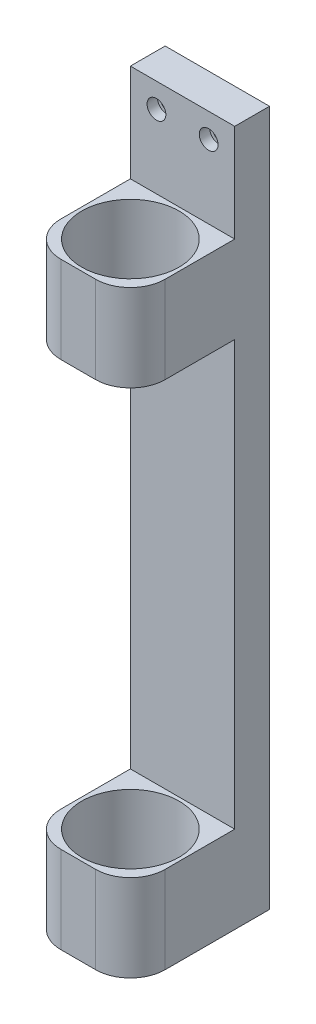
ISO-10303-21;
HEADER;
FILE_DESCRIPTION(('STEP AP214'),'2;1');
FILE_NAME('part.step','',(''),(''),'','','');
FILE_SCHEMA(('AUTOMOTIVE_DESIGN { 1 0 10303 214 1 1 1 1 }'));
ENDSEC;
DATA;
#1=APPLICATION_CONTEXT('core data for automotive mechanical design processes');
#2=APPLICATION_PROTOCOL_DEFINITION('international standard','automotive_design',2000,#1);
#3=PRODUCT_CONTEXT('',#1,'mechanical');
#4=PRODUCT('Part','Part','',(#3));
#5=PRODUCT_RELATED_PRODUCT_CATEGORY('part','',(#4));
#6=PRODUCT_DEFINITION_FORMATION('','',#4);
#7=PRODUCT_DEFINITION_CONTEXT('part definition',#1,'design');
#8=PRODUCT_DEFINITION('design','',#6,#7);
#9=PRODUCT_DEFINITION_SHAPE('','',#8);
#10=(LENGTH_UNIT() NAMED_UNIT(*) SI_UNIT(.MILLI.,.METRE.));
#11=(NAMED_UNIT(*) PLANE_ANGLE_UNIT() SI_UNIT($,.RADIAN.));
#12=(NAMED_UNIT(*) SI_UNIT($,.STERADIAN.) SOLID_ANGLE_UNIT());
#13=UNCERTAINTY_MEASURE_WITH_UNIT(LENGTH_MEASURE(1.E-05),#10,'distance_accuracy_value','');
#14=(GEOMETRIC_REPRESENTATION_CONTEXT(3) GLOBAL_UNCERTAINTY_ASSIGNED_CONTEXT((#13)) GLOBAL_UNIT_ASSIGNED_CONTEXT((#10,
#11,#12)) REPRESENTATION_CONTEXT('',''));
#15=CARTESIAN_POINT('',(0.,0.,0.));
#16=DIRECTION('',(0.,0.,1.));
#17=DIRECTION('',(1.,0.,0.));
#18=AXIS2_PLACEMENT_3D('',#15,#16,#17);
#19=CARTESIAN_POINT('',(5.,200.,25.));
#20=DIRECTION('',(0.,1.,0.));
#21=DIRECTION('',(0.,0.,1.));
#22=AXIS2_PLACEMENT_3D('',#19,#20,#21);
#23=CYLINDRICAL_SURFACE('',#22,10.);
#24=DIRECTION('',(0.,-1.,0.));
#25=VECTOR('',#24,1.);
#26=CARTESIAN_POINT('',(15.,200.,25.));
#27=LINE('',#26,#25);
#28=CARTESIAN_POINT('',(15.,171.928426997617,25.));
#29=VERTEX_POINT('',#28);
#30=CARTESIAN_POINT('',(15.,146.928426997617,25.));
#31=VERTEX_POINT('',#30);
#32=EDGE_CURVE('E143',#29,#31,#27,.T.);
#33=ORIENTED_EDGE('',*,*,#32,.F.);
#34=CARTESIAN_POINT('',(5.,171.928426997617,25.));
#35=DIRECTION('',(0.,-1.,0.));
#36=DIRECTION('',(0.,0.,-1.));
#37=AXIS2_PLACEMENT_3D('',#34,#35,#36);
#38=CIRCLE('',#37,10.);
#39=CARTESIAN_POINT('',(5.,171.928426997617,35.));
#40=VERTEX_POINT('',#39);
#41=EDGE_CURVE('E48',#40,#29,#38,.F.);
#42=ORIENTED_EDGE('',*,*,#41,.F.);
#43=DIRECTION('',(0.,-1.,0.));
#44=VECTOR('',#43,1.);
#45=CARTESIAN_POINT('',(5.,200.,35.));
#46=LINE('',#45,#44);
#47=CARTESIAN_POINT('',(5.,146.928426997617,35.));
#48=VERTEX_POINT('',#47);
#49=EDGE_CURVE('E257',#48,#40,#46,.F.);
#50=ORIENTED_EDGE('',*,*,#49,.F.);
#51=CARTESIAN_POINT('',(5.,146.928426997617,25.));
#52=DIRECTION('',(0.,1.,0.));
#53=DIRECTION('',(0.,0.,1.));
#54=AXIS2_PLACEMENT_3D('',#51,#52,#53);
#55=CIRCLE('',#54,10.);
#56=EDGE_CURVE('E11',#31,#48,#55,.F.);
#57=ORIENTED_EDGE('',*,*,#56,.F.);
#58=EDGE_LOOP('',(#33,#42,#50,#57));
#59=FACE_BOUND('',#58,.T.);
#60=ADVANCED_FACE('F37',(#59),#23,.T.);
#61=CARTESIAN_POINT('',(-5.,200.,25.));
#62=DIRECTION('',(0.,-1.,0.));
#63=DIRECTION('',(0.,0.,-1.));
#64=AXIS2_PLACEMENT_3D('',#61,#62,#63);
#65=CYLINDRICAL_SURFACE('',#64,10.);
#66=DIRECTION('',(0.,1.,0.));
#67=VECTOR('',#66,1.);
#68=CARTESIAN_POINT('',(-15.,200.,25.));
#69=LINE('',#68,#67);
#70=CARTESIAN_POINT('',(-15.,146.928426997617,25.));
#71=VERTEX_POINT('',#70);
#72=CARTESIAN_POINT('',(-15.,171.928426997617,25.));
#73=VERTEX_POINT('',#72);
#74=EDGE_CURVE('E242',#71,#73,#69,.T.);
#75=ORIENTED_EDGE('',*,*,#74,.F.);
#76=CARTESIAN_POINT('',(-5.,146.928426997617,25.));
#77=DIRECTION('',(0.,1.,0.));
#78=DIRECTION('',(0.,0.,1.));
#79=AXIS2_PLACEMENT_3D('',#76,#77,#78);
#80=CIRCLE('',#79,10.);
#81=CARTESIAN_POINT('',(-5.,146.928426997617,35.));
#82=VERTEX_POINT('',#81);
#83=EDGE_CURVE('E249',#82,#71,#80,.F.);
#84=ORIENTED_EDGE('',*,*,#83,.F.);
#85=DIRECTION('',(0.,1.,0.));
#86=VECTOR('',#85,1.);
#87=CARTESIAN_POINT('',(-5.,200.,35.));
#88=LINE('',#87,#86);
#89=CARTESIAN_POINT('',(-5.,171.928426997617,35.));
#90=VERTEX_POINT('',#89);
#91=EDGE_CURVE('E250',#90,#82,#88,.F.);
#92=ORIENTED_EDGE('',*,*,#91,.F.);
#93=CARTESIAN_POINT('',(-5.,171.928426997617,25.));
#94=DIRECTION('',(0.,-1.,0.));
#95=DIRECTION('',(0.,0.,-1.));
#96=AXIS2_PLACEMENT_3D('',#93,#94,#95);
#97=CIRCLE('',#96,10.);
#98=EDGE_CURVE('E255',#73,#90,#97,.F.);
#99=ORIENTED_EDGE('',*,*,#98,.F.);
#100=EDGE_LOOP('',(#75,#84,#92,#99));
#101=FACE_BOUND('',#100,.T.);
#102=ADVANCED_FACE('F277',(#101),#65,.T.);
#103=CARTESIAN_POINT('',(-15.,200.,5.));
#104=DIRECTION('',(0.,0.,-1.));
#105=DIRECTION('',(-1.,0.,0.));
#106=AXIS2_PLACEMENT_3D('',#103,#104,#105);
#107=PLANE('',#106);
#108=CARTESIAN_POINT('',(7.5,192.982106749404,5.));
#109=DIRECTION('',(0.,0.,1.));
#110=DIRECTION('',(1.,0.,0.));
#111=AXIS2_PLACEMENT_3D('',#108,#109,#110);
#112=CIRCLE('',#111,2.7);
#113=CARTESIAN_POINT('',(10.2,192.982106749404,5.));
#114=VERTEX_POINT('',#113);
#115=EDGE_CURVE('E302',#114,#114,#112,.T.);
#116=ORIENTED_EDGE('',*,*,#115,.F.);
#117=EDGE_LOOP('',(#116));
#118=FACE_BOUND('',#117,.T.);
#119=CARTESIAN_POINT('',(-7.5,192.982106749404,5.));
#120=DIRECTION('',(0.,0.,1.));
#121=DIRECTION('',(1.,0.,0.));
#122=AXIS2_PLACEMENT_3D('',#119,#120,#121);
#123=CIRCLE('',#122,2.7);
#124=CARTESIAN_POINT('',(-4.8,192.982106749404,5.));
#125=VERTEX_POINT('',#124);
#126=EDGE_CURVE('E292',#125,#125,#123,.T.);
#127=ORIENTED_EDGE('',*,*,#126,.F.);
#128=EDGE_LOOP('',(#127));
#129=FACE_BOUND('',#128,.T.);
#130=DIRECTION('',(-1.,0.,0.));
#131=VECTOR('',#130,1.);
#132=CARTESIAN_POINT('',(-15.,171.928426997617,5.));
#133=LINE('',#132,#131);
#134=CARTESIAN_POINT('',(15.,171.928426997617,5.));
#135=VERTEX_POINT('',#134);
#136=CARTESIAN_POINT('',(-15.,171.928426997617,5.));
#137=VERTEX_POINT('',#136);
#138=EDGE_CURVE('E161',#135,#137,#133,.T.);
#139=ORIENTED_EDGE('',*,*,#138,.F.);
#140=DIRECTION('',(0.,-1.,0.));
#141=VECTOR('',#140,1.);
#142=CARTESIAN_POINT('',(15.,200.,5.));
#143=LINE('',#142,#141);
#144=CARTESIAN_POINT('',(15.,200.,5.));
#145=VERTEX_POINT('',#144);
#146=EDGE_CURVE('E159',#145,#135,#143,.T.);
#147=ORIENTED_EDGE('',*,*,#146,.F.);
#148=DIRECTION('',(1.,0.,0.));
#149=VECTOR('',#148,1.);
#150=CARTESIAN_POINT('',(-15.,200.,5.));
#151=LINE('',#150,#149);
#152=CARTESIAN_POINT('',(-15.,200.,5.));
#153=VERTEX_POINT('',#152);
#154=EDGE_CURVE('E158',#153,#145,#151,.T.);
#155=ORIENTED_EDGE('',*,*,#154,.F.);
#156=DIRECTION('',(0.,-1.,0.));
#157=VECTOR('',#156,1.);
#158=CARTESIAN_POINT('',(-15.,200.,5.));
#159=LINE('',#158,#157);
#160=EDGE_CURVE('E211',#153,#137,#159,.T.);
#161=ORIENTED_EDGE('',*,*,#160,.T.);
#162=EDGE_LOOP('',(#139,#147,#155,#161));
#163=FACE_BOUND('',#162,.T.);
#164=ADVANCED_FACE('F267',(#118,#129,#163),#107,.F.);
#165=DIRECTION('',(1.,0.,0.));
#166=VECTOR('',#165,1.);
#167=CARTESIAN_POINT('',(-15.,146.928426997617,5.));
#168=LINE('',#167,#166);
#169=CARTESIAN_POINT('',(-15.,146.928426997617,5.));
#170=VERTEX_POINT('',#169);
#171=CARTESIAN_POINT('',(15.,146.928426997617,5.));
#172=VERTEX_POINT('',#171);
#173=EDGE_CURVE('E152',#170,#172,#168,.T.);
#174=ORIENTED_EDGE('',*,*,#173,.F.);
#175=CARTESIAN_POINT('',(-15.,25.,5.));
#176=VERTEX_POINT('',#175);
#177=EDGE_CURVE('E214',#170,#176,#159,.T.);
#178=ORIENTED_EDGE('',*,*,#177,.T.);
#179=DIRECTION('',(-1.,0.,0.));
#180=VECTOR('',#179,1.);
#181=CARTESIAN_POINT('',(-15.,25.,5.));
#182=LINE('',#181,#180);
#183=CARTESIAN_POINT('',(15.,25.,5.));
#184=VERTEX_POINT('',#183);
#185=EDGE_CURVE('E157',#184,#176,#182,.T.);
#186=ORIENTED_EDGE('',*,*,#185,.F.);
#187=EDGE_CURVE('E141',#172,#184,#143,.T.);
#188=ORIENTED_EDGE('',*,*,#187,.F.);
#189=EDGE_LOOP('',(#174,#178,#186,#188));
#190=FACE_BOUND('',#189,.T.);
#191=ADVANCED_FACE('F153',(#190),#107,.F.);
#192=CARTESIAN_POINT('',(-5.,0.,25.));
#193=DIRECTION('',(0.,-1.,0.));
#194=DIRECTION('',(0.,0.,-1.));
#195=AXIS2_PLACEMENT_3D('',#192,#193,#194);
#196=CYLINDRICAL_SURFACE('',#195,10.);
#197=DIRECTION('',(0.,-1.,0.));
#198=VECTOR('',#197,1.);
#199=CARTESIAN_POINT('',(-5.,0.,35.));
#200=LINE('',#199,#198);
#201=CARTESIAN_POINT('',(-5.,25.,35.));
#202=VERTEX_POINT('',#201);
#203=CARTESIAN_POINT('',(-5.,0.,35.));
#204=VERTEX_POINT('',#203);
#205=EDGE_CURVE('E234',#202,#204,#200,.T.);
#206=ORIENTED_EDGE('',*,*,#205,.F.);
#207=CARTESIAN_POINT('',(-5.,25.,25.));
#208=DIRECTION('',(0.,-1.,0.));
#209=DIRECTION('',(0.,0.,-1.));
#210=AXIS2_PLACEMENT_3D('',#207,#208,#209);
#211=CIRCLE('',#210,10.);
#212=CARTESIAN_POINT('',(-15.,25.,25.));
#213=VERTEX_POINT('',#212);
#214=EDGE_CURVE('E239',#213,#202,#211,.F.);
#215=ORIENTED_EDGE('',*,*,#214,.F.);
#216=DIRECTION('',(0.,-1.,0.));
#217=VECTOR('',#216,1.);
#218=CARTESIAN_POINT('',(-15.,200.,25.));
#219=LINE('',#218,#217);
#220=CARTESIAN_POINT('',(-15.,0.,25.));
#221=VERTEX_POINT('',#220);
#222=EDGE_CURVE('E240',#221,#213,#219,.F.);
#223=ORIENTED_EDGE('',*,*,#222,.F.);
#224=CARTESIAN_POINT('',(-5.,0.,25.));
#225=DIRECTION('',(0.,-1.,0.));
#226=DIRECTION('',(0.,0.,-1.));
#227=AXIS2_PLACEMENT_3D('',#224,#225,#226);
#228=CIRCLE('',#227,10.);
#229=EDGE_CURVE('E245',#204,#221,#228,.T.);
#230=ORIENTED_EDGE('',*,*,#229,.F.);
#231=EDGE_LOOP('',(#206,#215,#223,#230));
#232=FACE_BOUND('',#231,.T.);
#233=ADVANCED_FACE('F332',(#232),#196,.T.);
#234=CARTESIAN_POINT('',(5.,200.,25.));
#235=DIRECTION('',(0.,-1.,0.));
#236=DIRECTION('',(0.,0.,-1.));
#237=AXIS2_PLACEMENT_3D('',#234,#235,#236);
#238=CYLINDRICAL_SURFACE('',#237,10.);
#239=DIRECTION('',(0.,-1.,0.));
#240=VECTOR('',#239,1.);
#241=CARTESIAN_POINT('',(15.,200.,25.));
#242=LINE('',#241,#240);
#243=CARTESIAN_POINT('',(15.,25.,25.));
#244=VERTEX_POINT('',#243);
#245=CARTESIAN_POINT('',(15.,0.,25.));
#246=VERTEX_POINT('',#245);
#247=EDGE_CURVE('E224',#244,#246,#242,.T.);
#248=ORIENTED_EDGE('',*,*,#247,.F.);
#249=CARTESIAN_POINT('',(5.,25.,25.));
#250=DIRECTION('',(0.,-1.,0.));
#251=DIRECTION('',(0.,0.,-1.));
#252=AXIS2_PLACEMENT_3D('',#249,#250,#251);
#253=CIRCLE('',#252,10.);
#254=CARTESIAN_POINT('',(5.,25.,35.));
#255=VERTEX_POINT('',#254);
#256=EDGE_CURVE('E230',#255,#244,#253,.F.);
#257=ORIENTED_EDGE('',*,*,#256,.F.);
#258=DIRECTION('',(0.,-1.,0.));
#259=VECTOR('',#258,1.);
#260=CARTESIAN_POINT('',(5.,0.,35.));
#261=LINE('',#260,#259);
#262=CARTESIAN_POINT('',(5.,0.,35.));
#263=VERTEX_POINT('',#262);
#264=EDGE_CURVE('E228',#263,#255,#261,.F.);
#265=ORIENTED_EDGE('',*,*,#264,.F.);
#266=CARTESIAN_POINT('',(5.,0.,25.));
#267=DIRECTION('',(0.,-1.,0.));
#268=DIRECTION('',(0.,0.,-1.));
#269=AXIS2_PLACEMENT_3D('',#266,#267,#268);
#270=CIRCLE('',#269,10.);
#271=EDGE_CURVE('E233',#246,#263,#270,.T.);
#272=ORIENTED_EDGE('',*,*,#271,.F.);
#273=EDGE_LOOP('',(#248,#257,#265,#272));
#274=FACE_BOUND('',#273,.T.);
#275=ADVANCED_FACE('F338',(#274),#238,.T.);
#276=CARTESIAN_POINT('',(15.,200.,5.));
#277=DIRECTION('',(-1.,0.,0.));
#278=DIRECTION('',(0.,0.,1.));
#279=AXIS2_PLACEMENT_3D('',#276,#277,#278);
#280=PLANE('',#279);
#281=DIRECTION('',(0.,0.,-1.));
#282=VECTOR('',#281,1.);
#283=CARTESIAN_POINT('',(15.,171.928426997617,35.));
#284=LINE('',#283,#282);
#285=EDGE_CURVE('E149',#29,#135,#284,.T.);
#286=ORIENTED_EDGE('',*,*,#285,.F.);
#287=ORIENTED_EDGE('',*,*,#32,.T.);
#288=DIRECTION('',(0.,0.,-1.));
#289=VECTOR('',#288,1.);
#290=CARTESIAN_POINT('',(15.,146.928426997617,35.));
#291=LINE('',#290,#289);
#292=EDGE_CURVE('E139',#31,#172,#291,.T.);
#293=ORIENTED_EDGE('',*,*,#292,.T.);
#294=ORIENTED_EDGE('',*,*,#187,.T.);
#295=DIRECTION('',(0.,0.,-1.));
#296=VECTOR('',#295,1.);
#297=CARTESIAN_POINT('',(15.,25.,35.));
#298=LINE('',#297,#296);
#299=EDGE_CURVE('E193',#244,#184,#298,.T.);
#300=ORIENTED_EDGE('',*,*,#299,.F.);
#301=ORIENTED_EDGE('',*,*,#247,.T.);
#302=DIRECTION('',(0.,0.,-1.));
#303=VECTOR('',#302,1.);
#304=CARTESIAN_POINT('',(15.,0.,5.));
#305=LINE('',#304,#303);
#306=CARTESIAN_POINT('',(15.,0.,-5.));
#307=VERTEX_POINT('',#306);
#308=EDGE_CURVE('E200',#246,#307,#305,.T.);
#309=ORIENTED_EDGE('',*,*,#308,.T.);
#310=DIRECTION('',(0.,-1.,0.));
#311=VECTOR('',#310,1.);
#312=CARTESIAN_POINT('',(15.,200.,-5.));
#313=LINE('',#312,#311);
#314=CARTESIAN_POINT('',(15.,200.,-5.));
#315=VERTEX_POINT('',#314);
#316=EDGE_CURVE('E219',#315,#307,#313,.T.);
#317=ORIENTED_EDGE('',*,*,#316,.F.);
#318=DIRECTION('',(0.,0.,-1.));
#319=VECTOR('',#318,1.);
#320=CARTESIAN_POINT('',(15.,200.,5.));
#321=LINE('',#320,#319);
#322=EDGE_CURVE('E198',#145,#315,#321,.T.);
#323=ORIENTED_EDGE('',*,*,#322,.F.);
#324=ORIENTED_EDGE('',*,*,#146,.T.);
#325=EDGE_LOOP('',(#286,#287,#293,#294,#300,#301,#309,#317,#323,#324));
#326=FACE_BOUND('',#325,.T.);
#327=ADVANCED_FACE('F142',(#326),#280,.F.);
#328=CARTESIAN_POINT('',(-15.,200.,-5.));
#329=DIRECTION('',(0.,0.,1.));
#330=DIRECTION('',(1.,0.,0.));
#331=AXIS2_PLACEMENT_3D('',#328,#329,#330);
#332=PLANE('',#331);
#333=CARTESIAN_POINT('',(7.5,192.982106749404,-5.));
#334=DIRECTION('',(0.,0.,1.));
#335=DIRECTION('',(1.,0.,0.));
#336=AXIS2_PLACEMENT_3D('',#333,#334,#335);
#337=CIRCLE('',#336,1.7);
#338=CARTESIAN_POINT('',(9.2,192.982106749404,-5.));
#339=VERTEX_POINT('',#338);
#340=EDGE_CURVE('E294',#339,#339,#337,.T.);
#341=ORIENTED_EDGE('',*,*,#340,.T.);
#342=EDGE_LOOP('',(#341));
#343=FACE_BOUND('',#342,.T.);
#344=CARTESIAN_POINT('',(-7.5,192.982106749404,-5.));
#345=DIRECTION('',(0.,0.,1.));
#346=DIRECTION('',(1.,0.,0.));
#347=AXIS2_PLACEMENT_3D('',#344,#345,#346);
#348=CIRCLE('',#347,1.7);
#349=CARTESIAN_POINT('',(-5.8,192.982106749404,-5.));
#350=VERTEX_POINT('',#349);
#351=EDGE_CURVE('E283',#350,#350,#348,.T.);
#352=ORIENTED_EDGE('',*,*,#351,.T.);
#353=EDGE_LOOP('',(#352));
#354=FACE_BOUND('',#353,.T.);
#355=DIRECTION('',(-1.,0.,0.));
#356=VECTOR('',#355,1.);
#357=CARTESIAN_POINT('',(-15.,0.,-5.));
#358=LINE('',#357,#356);
#359=CARTESIAN_POINT('',(-15.,0.,-5.));
#360=VERTEX_POINT('',#359);
#361=EDGE_CURVE('E206',#307,#360,#358,.T.);
#362=ORIENTED_EDGE('',*,*,#361,.T.);
#363=DIRECTION('',(0.,-1.,0.));
#364=VECTOR('',#363,1.);
#365=CARTESIAN_POINT('',(-15.,200.,-5.));
#366=LINE('',#365,#364);
#367=CARTESIAN_POINT('',(-15.,200.,-5.));
#368=VERTEX_POINT('',#367);
#369=EDGE_CURVE('E220',#368,#360,#366,.T.);
#370=ORIENTED_EDGE('',*,*,#369,.F.);
#371=DIRECTION('',(-1.,0.,0.));
#372=VECTOR('',#371,1.);
#373=CARTESIAN_POINT('',(-15.,200.,-5.));
#374=LINE('',#373,#372);
#375=EDGE_CURVE('E201',#315,#368,#374,.T.);
#376=ORIENTED_EDGE('',*,*,#375,.F.);
#377=ORIENTED_EDGE('',*,*,#316,.T.);
#378=EDGE_LOOP('',(#362,#370,#376,#377));
#379=FACE_BOUND('',#378,.T.);
#380=ADVANCED_FACE('F340',(#343,#354,#379),#332,.F.);
#381=CARTESIAN_POINT('',(-15.,200.,5.));
#382=DIRECTION('',(1.,0.,0.));
#383=DIRECTION('',(0.,0.,-1.));
#384=AXIS2_PLACEMENT_3D('',#381,#382,#383);
#385=PLANE('',#384);
#386=DIRECTION('',(0.,0.,-1.));
#387=VECTOR('',#386,1.);
#388=CARTESIAN_POINT('',(-15.,146.928426997617,35.));
#389=LINE('',#388,#387);
#390=EDGE_CURVE('E150',#71,#170,#389,.T.);
#391=ORIENTED_EDGE('',*,*,#390,.F.);
#392=ORIENTED_EDGE('',*,*,#74,.T.);
#393=DIRECTION('',(0.,0.,-1.));
#394=VECTOR('',#393,1.);
#395=CARTESIAN_POINT('',(-15.,171.928426997617,35.));
#396=LINE('',#395,#394);
#397=EDGE_CURVE('E176',#73,#137,#396,.T.);
#398=ORIENTED_EDGE('',*,*,#397,.T.);
#399=ORIENTED_EDGE('',*,*,#160,.F.);
#400=DIRECTION('',(0.,0.,1.));
#401=VECTOR('',#400,1.);
#402=CARTESIAN_POINT('',(-15.,200.,5.));
#403=LINE('',#402,#401);
#404=EDGE_CURVE('E203',#368,#153,#403,.T.);
#405=ORIENTED_EDGE('',*,*,#404,.F.);
#406=ORIENTED_EDGE('',*,*,#369,.T.);
#407=DIRECTION('',(0.,0.,1.));
#408=VECTOR('',#407,1.);
#409=CARTESIAN_POINT('',(-15.,0.,5.));
#410=LINE('',#409,#408);
#411=EDGE_CURVE('E202',#360,#221,#410,.T.);
#412=ORIENTED_EDGE('',*,*,#411,.T.);
#413=ORIENTED_EDGE('',*,*,#222,.T.);
#414=DIRECTION('',(0.,0.,-1.));
#415=VECTOR('',#414,1.);
#416=CARTESIAN_POINT('',(-15.,25.,35.));
#417=LINE('',#416,#415);
#418=EDGE_CURVE('E192',#213,#176,#417,.T.);
#419=ORIENTED_EDGE('',*,*,#418,.T.);
#420=ORIENTED_EDGE('',*,*,#177,.F.);
#421=EDGE_LOOP('',(#391,#392,#398,#399,#405,#406,#412,#413,#419,#420));
#422=FACE_BOUND('',#421,.T.);
#423=ADVANCED_FACE('F275',(#422),#385,.F.);
#424=CARTESIAN_POINT('',(0.,200.,0.));
#425=DIRECTION('',(0.,-1.,0.));
#426=DIRECTION('',(0.,0.,-1.));
#427=AXIS2_PLACEMENT_3D('',#424,#425,#426);
#428=PLANE('',#427);
#429=ORIENTED_EDGE('',*,*,#322,.T.);
#430=ORIENTED_EDGE('',*,*,#375,.T.);
#431=ORIENTED_EDGE('',*,*,#404,.T.);
#432=ORIENTED_EDGE('',*,*,#154,.T.);
#433=EDGE_LOOP('',(#429,#430,#431,#432));
#434=FACE_BOUND('',#433,.T.);
#435=ADVANCED_FACE('F318',(#434),#428,.F.);
#436=CARTESIAN_POINT('',(0.,0.,0.));
#437=DIRECTION('',(0.,-1.,0.));
#438=DIRECTION('',(0.,0.,-1.));
#439=AXIS2_PLACEMENT_3D('',#436,#437,#438);
#440=PLANE('',#439);
#441=CARTESIAN_POINT('',(0.,0.,20.));
#442=DIRECTION('',(0.,-1.,0.));
#443=DIRECTION('',(0.,0.,-1.));
#444=AXIS2_PLACEMENT_3D('',#441,#442,#443);
#445=CIRCLE('',#444,10.);
#446=CARTESIAN_POINT('',(0.,0.,9.99999999999999));
#447=VERTEX_POINT('',#446);
#448=EDGE_CURVE('E43',#447,#447,#445,.T.);
#449=ORIENTED_EDGE('',*,*,#448,.F.);
#450=EDGE_LOOP('',(#449));
#451=FACE_BOUND('',#450,.T.);
#452=DIRECTION('',(1.,0.,0.));
#453=VECTOR('',#452,1.);
#454=CARTESIAN_POINT('',(-15.,0.,35.));
#455=LINE('',#454,#453);
#456=EDGE_CURVE('E187',#204,#263,#455,.T.);
#457=ORIENTED_EDGE('',*,*,#456,.F.);
#458=ORIENTED_EDGE('',*,*,#229,.T.);
#459=ORIENTED_EDGE('',*,*,#411,.F.);
#460=ORIENTED_EDGE('',*,*,#361,.F.);
#461=ORIENTED_EDGE('',*,*,#308,.F.);
#462=ORIENTED_EDGE('',*,*,#271,.T.);
#463=EDGE_LOOP('',(#457,#458,#459,#460,#461,#462));
#464=FACE_BOUND('',#463,.T.);
#465=ADVANCED_FACE('F317',(#451,#464),#440,.T.);
#466=CARTESIAN_POINT('',(-15.,25.,35.));
#467=DIRECTION('',(0.,-1.,0.));
#468=DIRECTION('',(0.,0.,-1.));
#469=AXIS2_PLACEMENT_3D('',#466,#467,#468);
#470=PLANE('',#469);
#471=CARTESIAN_POINT('',(0.,25.,20.));
#472=DIRECTION('',(0.,1.,0.));
#473=DIRECTION('',(0.,0.,1.));
#474=AXIS2_PLACEMENT_3D('',#471,#472,#473);
#475=CIRCLE('',#474,14.);
#476=CARTESIAN_POINT('',(0.,25.,34.));
#477=VERTEX_POINT('',#476);
#478=EDGE_CURVE('E179',#477,#477,#475,.T.);
#479=ORIENTED_EDGE('',*,*,#478,.F.);
#480=EDGE_LOOP('',(#479));
#481=FACE_BOUND('',#480,.T.);
#482=ORIENTED_EDGE('',*,*,#418,.F.);
#483=ORIENTED_EDGE('',*,*,#214,.T.);
#484=DIRECTION('',(-1.,0.,0.));
#485=VECTOR('',#484,1.);
#486=CARTESIAN_POINT('',(-15.,25.,35.));
#487=LINE('',#486,#485);
#488=EDGE_CURVE('E189',#255,#202,#487,.T.);
#489=ORIENTED_EDGE('',*,*,#488,.F.);
#490=ORIENTED_EDGE('',*,*,#256,.T.);
#491=ORIENTED_EDGE('',*,*,#299,.T.);
#492=ORIENTED_EDGE('',*,*,#185,.T.);
#493=EDGE_LOOP('',(#482,#483,#489,#490,#491,#492));
#494=FACE_BOUND('',#493,.T.);
#495=ADVANCED_FACE('F316',(#481,#494),#470,.F.);
#496=CARTESIAN_POINT('',(0.,0.,35.));
#497=DIRECTION('',(0.,0.,-1.));
#498=DIRECTION('',(-1.,0.,0.));
#499=AXIS2_PLACEMENT_3D('',#496,#497,#498);
#500=PLANE('',#499);
#501=ORIENTED_EDGE('',*,*,#488,.T.);
#502=ORIENTED_EDGE('',*,*,#205,.T.);
#503=ORIENTED_EDGE('',*,*,#456,.T.);
#504=ORIENTED_EDGE('',*,*,#264,.T.);
#505=EDGE_LOOP('',(#501,#502,#503,#504));
#506=FACE_BOUND('',#505,.T.);
#507=ADVANCED_FACE('F328',(#506),#500,.F.);
#508=CARTESIAN_POINT('',(0.,2.,20.));
#509=DIRECTION('',(0.,1.,0.));
#510=DIRECTION('',(0.,0.,1.));
#511=AXIS2_PLACEMENT_3D('',#508,#509,#510);
#512=CYLINDRICAL_SURFACE('',#511,14.);
#513=CARTESIAN_POINT('',(0.,2.,20.));
#514=DIRECTION('',(0.,1.,0.));
#515=DIRECTION('',(0.,0.,1.));
#516=AXIS2_PLACEMENT_3D('',#513,#514,#515);
#517=CIRCLE('',#516,14.);
#518=CARTESIAN_POINT('',(0.,2.,34.));
#519=VERTEX_POINT('',#518);
#520=EDGE_CURVE('E181',#519,#519,#517,.T.);
#521=ORIENTED_EDGE('',*,*,#520,.F.);
#522=EDGE_LOOP('',(#521));
#523=FACE_BOUND('',#522,.T.);
#524=ORIENTED_EDGE('',*,*,#478,.T.);
#525=EDGE_LOOP('',(#524));
#526=FACE_BOUND('',#525,.T.);
#527=ADVANCED_FACE('F347',(#523,#526),#512,.F.);
#528=CARTESIAN_POINT('',(0.,2.,20.));
#529=DIRECTION('',(0.,1.,0.));
#530=DIRECTION('',(0.,0.,1.));
#531=AXIS2_PLACEMENT_3D('',#528,#529,#530);
#532=PLANE('',#531);
#533=CARTESIAN_POINT('',(0.,2.,20.));
#534=DIRECTION('',(0.,1.,0.));
#535=DIRECTION('',(0.,0.,1.));
#536=AXIS2_PLACEMENT_3D('',#533,#534,#535);
#537=CIRCLE('',#536,10.);
#538=CARTESIAN_POINT('',(0.,2.,30.));
#539=VERTEX_POINT('',#538);
#540=EDGE_CURVE('E310',#539,#539,#537,.T.);
#541=ORIENTED_EDGE('',*,*,#540,.F.);
#542=EDGE_LOOP('',(#541));
#543=FACE_BOUND('',#542,.T.);
#544=ORIENTED_EDGE('',*,*,#520,.T.);
#545=EDGE_LOOP('',(#544));
#546=FACE_BOUND('',#545,.T.);
#547=ADVANCED_FACE('F383',(#543,#546),#532,.T.);
#548=CARTESIAN_POINT('',(-15.,146.928426997617,35.));
#549=DIRECTION('',(0.,1.,0.));
#550=DIRECTION('',(0.,0.,1.));
#551=AXIS2_PLACEMENT_3D('',#548,#549,#550);
#552=PLANE('',#551);
#553=CARTESIAN_POINT('',(0.,146.928426997617,20.));
#554=DIRECTION('',(0.,1.,0.));
#555=DIRECTION('',(0.,0.,1.));
#556=AXIS2_PLACEMENT_3D('',#553,#554,#555);
#557=CIRCLE('',#556,14.);
#558=CARTESIAN_POINT('',(0.,146.928426997617,34.));
#559=VERTEX_POINT('',#558);
#560=EDGE_CURVE('E165',#559,#559,#557,.T.);
#561=ORIENTED_EDGE('',*,*,#560,.T.);
#562=EDGE_LOOP('',(#561));
#563=FACE_BOUND('',#562,.T.);
#564=ORIENTED_EDGE('',*,*,#292,.F.);
#565=ORIENTED_EDGE('',*,*,#56,.T.);
#566=DIRECTION('',(1.,0.,0.));
#567=VECTOR('',#566,1.);
#568=CARTESIAN_POINT('',(-15.,146.928426997617,35.));
#569=LINE('',#568,#567);
#570=EDGE_CURVE('E170',#82,#48,#569,.T.);
#571=ORIENTED_EDGE('',*,*,#570,.F.);
#572=ORIENTED_EDGE('',*,*,#83,.T.);
#573=ORIENTED_EDGE('',*,*,#390,.T.);
#574=ORIENTED_EDGE('',*,*,#173,.T.);
#575=EDGE_LOOP('',(#564,#565,#571,#572,#573,#574));
#576=FACE_BOUND('',#575,.T.);
#577=ADVANCED_FACE('F163',(#563,#576),#552,.F.);
#578=CARTESIAN_POINT('',(-15.,171.928426997617,35.));
#579=DIRECTION('',(0.,-1.,0.));
#580=DIRECTION('',(0.,0.,-1.));
#581=AXIS2_PLACEMENT_3D('',#578,#579,#580);
#582=PLANE('',#581);
#583=CARTESIAN_POINT('',(0.,171.928426997617,20.));
#584=DIRECTION('',(0.,1.,0.));
#585=DIRECTION('',(0.,0.,1.));
#586=AXIS2_PLACEMENT_3D('',#583,#584,#585);
#587=CIRCLE('',#586,14.);
#588=CARTESIAN_POINT('',(0.,171.928426997617,34.));
#589=VERTEX_POINT('',#588);
#590=EDGE_CURVE('E167',#589,#589,#587,.T.);
#591=ORIENTED_EDGE('',*,*,#590,.F.);
#592=EDGE_LOOP('',(#591));
#593=FACE_BOUND('',#592,.T.);
#594=DIRECTION('',(-1.,0.,0.));
#595=VECTOR('',#594,1.);
#596=CARTESIAN_POINT('',(-15.,171.928426997617,35.));
#597=LINE('',#596,#595);
#598=EDGE_CURVE('E173',#40,#90,#597,.T.);
#599=ORIENTED_EDGE('',*,*,#598,.F.);
#600=ORIENTED_EDGE('',*,*,#41,.T.);
#601=ORIENTED_EDGE('',*,*,#285,.T.);
#602=ORIENTED_EDGE('',*,*,#138,.T.);
#603=ORIENTED_EDGE('',*,*,#397,.F.);
#604=ORIENTED_EDGE('',*,*,#98,.T.);
#605=EDGE_LOOP('',(#599,#600,#601,#602,#603,#604));
#606=FACE_BOUND('',#605,.T.);
#607=ADVANCED_FACE('F258',(#593,#606),#582,.F.);
#608=CARTESIAN_POINT('',(0.,0.,35.));
#609=DIRECTION('',(0.,0.,1.));
#610=DIRECTION('',(1.,0.,0.));
#611=AXIS2_PLACEMENT_3D('',#608,#609,#610);
#612=PLANE('',#611);
#613=ORIENTED_EDGE('',*,*,#570,.T.);
#614=ORIENTED_EDGE('',*,*,#49,.T.);
#615=ORIENTED_EDGE('',*,*,#598,.T.);
#616=ORIENTED_EDGE('',*,*,#91,.T.);
#617=EDGE_LOOP('',(#613,#614,#615,#616));
#618=FACE_BOUND('',#617,.T.);
#619=ADVANCED_FACE('F276',(#618),#612,.T.);
#620=CARTESIAN_POINT('',(0.,141.928426997617,20.));
#621=DIRECTION('',(0.,1.,0.));
#622=DIRECTION('',(0.,0.,1.));
#623=AXIS2_PLACEMENT_3D('',#620,#621,#622);
#624=CYLINDRICAL_SURFACE('',#623,14.);
#625=ORIENTED_EDGE('',*,*,#590,.T.);
#626=EDGE_LOOP('',(#625));
#627=FACE_BOUND('',#626,.T.);
#628=ORIENTED_EDGE('',*,*,#560,.F.);
#629=EDGE_LOOP('',(#628));
#630=FACE_BOUND('',#629,.T.);
#631=ADVANCED_FACE('F458',(#627,#630),#624,.F.);
#632=CARTESIAN_POINT('',(-7.5,192.982106749404,5.));
#633=DIRECTION('',(0.,0.,1.));
#634=DIRECTION('',(1.,0.,0.));
#635=AXIS2_PLACEMENT_3D('',#632,#633,#634);
#636=CYLINDRICAL_SURFACE('',#635,1.7);
#637=ORIENTED_EDGE('',*,*,#351,.F.);
#638=EDGE_LOOP('',(#637));
#639=FACE_BOUND('',#638,.T.);
#640=CARTESIAN_POINT('',(-7.5,192.982106749404,2.));
#641=DIRECTION('',(0.,0.,1.));
#642=DIRECTION('',(1.,0.,0.));
#643=AXIS2_PLACEMENT_3D('',#640,#641,#642);
#644=CIRCLE('',#643,1.7);
#645=CARTESIAN_POINT('',(-5.8,192.982106749404,2.));
#646=VERTEX_POINT('',#645);
#647=EDGE_CURVE('E286',#646,#646,#644,.T.);
#648=ORIENTED_EDGE('',*,*,#647,.T.);
#649=EDGE_LOOP('',(#648));
#650=FACE_BOUND('',#649,.T.);
#651=ADVANCED_FACE('F467',(#639,#650),#636,.F.);
#652=CARTESIAN_POINT('',(-5.8,192.982106749404,2.));
#653=DIRECTION('',(0.,0.,-1.));
#654=DIRECTION('',(-1.,0.,0.));
#655=AXIS2_PLACEMENT_3D('',#652,#653,#654);
#656=PLANE('',#655);
#657=ORIENTED_EDGE('',*,*,#647,.F.);
#658=EDGE_LOOP('',(#657));
#659=FACE_BOUND('',#658,.T.);
#660=CARTESIAN_POINT('',(-7.5,192.982106749404,2.));
#661=DIRECTION('',(0.,0.,1.));
#662=DIRECTION('',(1.,0.,0.));
#663=AXIS2_PLACEMENT_3D('',#660,#661,#662);
#664=CIRCLE('',#663,2.7);
#665=CARTESIAN_POINT('',(-4.8,192.982106749404,2.));
#666=VERTEX_POINT('',#665);
#667=EDGE_CURVE('E288',#666,#666,#664,.T.);
#668=ORIENTED_EDGE('',*,*,#667,.T.);
#669=EDGE_LOOP('',(#668));
#670=FACE_BOUND('',#669,.T.);
#671=ADVANCED_FACE('F483',(#659,#670),#656,.F.);
#672=CARTESIAN_POINT('',(-7.5,192.982106749404,5.));
#673=DIRECTION('',(0.,0.,1.));
#674=DIRECTION('',(1.,0.,0.));
#675=AXIS2_PLACEMENT_3D('',#672,#673,#674);
#676=CYLINDRICAL_SURFACE('',#675,2.7);
#677=ORIENTED_EDGE('',*,*,#667,.F.);
#678=EDGE_LOOP('',(#677));
#679=FACE_BOUND('',#678,.T.);
#680=ORIENTED_EDGE('',*,*,#126,.T.);
#681=EDGE_LOOP('',(#680));
#682=FACE_BOUND('',#681,.T.);
#683=ADVANCED_FACE('F494',(#679,#682),#676,.F.);
#684=CARTESIAN_POINT('',(7.5,192.982106749404,5.));
#685=DIRECTION('',(0.,0.,1.));
#686=DIRECTION('',(1.,0.,0.));
#687=AXIS2_PLACEMENT_3D('',#684,#685,#686);
#688=CYLINDRICAL_SURFACE('',#687,1.7);
#689=ORIENTED_EDGE('',*,*,#340,.F.);
#690=EDGE_LOOP('',(#689));
#691=FACE_BOUND('',#690,.T.);
#692=CARTESIAN_POINT('',(7.5,192.982106749404,2.));
#693=DIRECTION('',(0.,0.,1.));
#694=DIRECTION('',(1.,0.,0.));
#695=AXIS2_PLACEMENT_3D('',#692,#693,#694);
#696=CIRCLE('',#695,1.7);
#697=CARTESIAN_POINT('',(9.2,192.982106749404,2.));
#698=VERTEX_POINT('',#697);
#699=EDGE_CURVE('E296',#698,#698,#696,.T.);
#700=ORIENTED_EDGE('',*,*,#699,.T.);
#701=EDGE_LOOP('',(#700));
#702=FACE_BOUND('',#701,.T.);
#703=ADVANCED_FACE('F503',(#691,#702),#688,.F.);
#704=CARTESIAN_POINT('',(9.2,192.982106749404,2.));
#705=DIRECTION('',(0.,0.,-1.));
#706=DIRECTION('',(-1.,0.,0.));
#707=AXIS2_PLACEMENT_3D('',#704,#705,#706);
#708=PLANE('',#707);
#709=ORIENTED_EDGE('',*,*,#699,.F.);
#710=EDGE_LOOP('',(#709));
#711=FACE_BOUND('',#710,.T.);
#712=CARTESIAN_POINT('',(7.5,192.982106749404,2.));
#713=DIRECTION('',(0.,0.,1.));
#714=DIRECTION('',(1.,0.,0.));
#715=AXIS2_PLACEMENT_3D('',#712,#713,#714);
#716=CIRCLE('',#715,2.7);
#717=CARTESIAN_POINT('',(10.2,192.982106749404,2.));
#718=VERTEX_POINT('',#717);
#719=EDGE_CURVE('E301',#718,#718,#716,.T.);
#720=ORIENTED_EDGE('',*,*,#719,.T.);
#721=EDGE_LOOP('',(#720));
#722=FACE_BOUND('',#721,.T.);
#723=ADVANCED_FACE('F514',(#711,#722),#708,.F.);
#724=CARTESIAN_POINT('',(7.5,192.982106749404,5.));
#725=DIRECTION('',(0.,0.,1.));
#726=DIRECTION('',(1.,0.,0.));
#727=AXIS2_PLACEMENT_3D('',#724,#725,#726);
#728=CYLINDRICAL_SURFACE('',#727,2.7);
#729=ORIENTED_EDGE('',*,*,#719,.F.);
#730=EDGE_LOOP('',(#729));
#731=FACE_BOUND('',#730,.T.);
#732=ORIENTED_EDGE('',*,*,#115,.T.);
#733=EDGE_LOOP('',(#732));
#734=FACE_BOUND('',#733,.T.);
#735=ADVANCED_FACE('F523',(#731,#734),#728,.F.);
#736=CARTESIAN_POINT('',(0.,-8.,20.));
#737=DIRECTION('',(0.,1.,0.));
#738=DIRECTION('',(0.,0.,1.));
#739=AXIS2_PLACEMENT_3D('',#736,#737,#738);
#740=CYLINDRICAL_SURFACE('',#739,10.);
#741=ORIENTED_EDGE('',*,*,#448,.T.);
#742=EDGE_LOOP('',(#741));
#743=FACE_BOUND('',#742,.T.);
#744=ORIENTED_EDGE('',*,*,#540,.T.);
#745=EDGE_LOOP('',(#744));
#746=FACE_BOUND('',#745,.T.);
#747=ADVANCED_FACE('F313',(#743,#746),#740,.F.);
#748=CLOSED_SHELL('',(#60,#102,#164,#191,#233,#275,#327,#380,#423,#435,#465,#495,#507,#527,#547,
#577,#607,#619,#631,#651,#671,#683,#703,#723,#735,#747));
#749=MANIFOLD_SOLID_BREP('B2',#748);
#750=ADVANCED_BREP_SHAPE_REPRESENTATION('',(#18,#749),#14);
#751=SHAPE_DEFINITION_REPRESENTATION(#9,#750);
ENDSEC;
END-ISO-10303-21;
